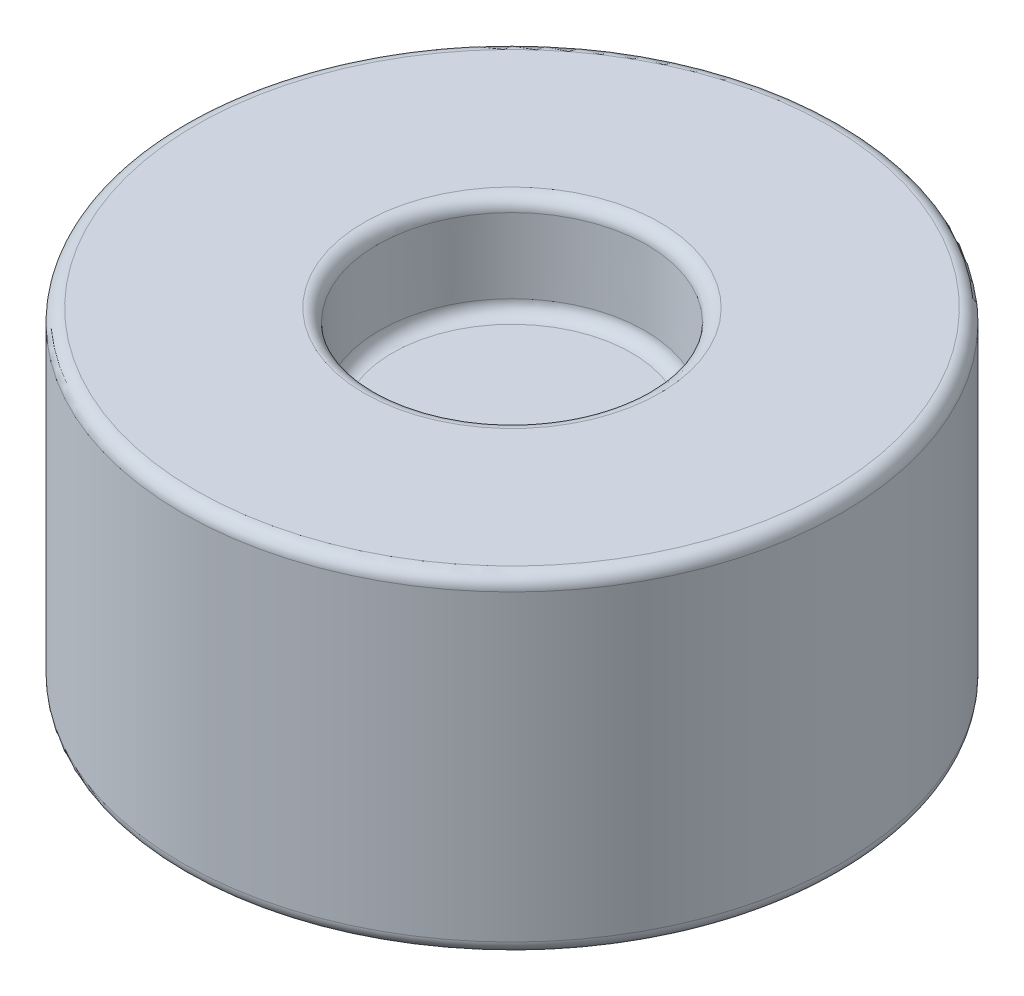
ISO-10303-21;
HEADER;
FILE_DESCRIPTION(('STEP AP214'),'2;1');
FILE_NAME('part.step','',(''),(''),'','','');
FILE_SCHEMA(('AUTOMOTIVE_DESIGN { 1 0 10303 214 1 1 1 1 }'));
ENDSEC;
DATA;
#1=APPLICATION_CONTEXT('core data for automotive mechanical design processes');
#2=APPLICATION_PROTOCOL_DEFINITION('international standard','automotive_design',2000,#1);
#3=PRODUCT_CONTEXT('',#1,'mechanical');
#4=PRODUCT('Part','Part','',(#3));
#5=PRODUCT_RELATED_PRODUCT_CATEGORY('part','',(#4));
#6=PRODUCT_DEFINITION_FORMATION('','',#4);
#7=PRODUCT_DEFINITION_CONTEXT('part definition',#1,'design');
#8=PRODUCT_DEFINITION('design','',#6,#7);
#9=PRODUCT_DEFINITION_SHAPE('','',#8);
#10=(LENGTH_UNIT() NAMED_UNIT(*) SI_UNIT(.MILLI.,.METRE.));
#11=(NAMED_UNIT(*) PLANE_ANGLE_UNIT() SI_UNIT($,.RADIAN.));
#12=(NAMED_UNIT(*) SI_UNIT($,.STERADIAN.) SOLID_ANGLE_UNIT());
#13=UNCERTAINTY_MEASURE_WITH_UNIT(LENGTH_MEASURE(1.E-05),#10,'distance_accuracy_value','');
#14=(GEOMETRIC_REPRESENTATION_CONTEXT(3) GLOBAL_UNCERTAINTY_ASSIGNED_CONTEXT((#13)) GLOBAL_UNIT_ASSIGNED_CONTEXT((#10,
#11,#12)) REPRESENTATION_CONTEXT('',''));
#15=CARTESIAN_POINT('',(0.,0.,0.));
#16=DIRECTION('',(0.,0.,1.));
#17=DIRECTION('',(1.,0.,0.));
#18=AXIS2_PLACEMENT_3D('',#15,#16,#17);
#19=CARTESIAN_POINT('',(0.,5.,0.));
#20=DIRECTION('',(0.,-1.,0.));
#21=DIRECTION('',(0.,0.,-1.));
#22=AXIS2_PLACEMENT_3D('',#19,#20,#21);
#23=CYLINDRICAL_SURFACE('',#22,5.);
#24=CARTESIAN_POINT('',(0.,0.2,0.));
#25=DIRECTION('',(0.,1.,0.));
#26=DIRECTION('',(0.,0.,1.));
#27=AXIS2_PLACEMENT_3D('',#24,#25,#26);
#28=CIRCLE('',#27,5.);
#29=CARTESIAN_POINT('',(0.,0.2,5.));
#30=VERTEX_POINT('',#29);
#31=EDGE_CURVE('E61',#30,#30,#28,.T.);
#32=ORIENTED_EDGE('',*,*,#31,.T.);
#33=EDGE_LOOP('',(#32));
#34=FACE_BOUND('',#33,.T.);
#35=CARTESIAN_POINT('',(0.,4.8,0.));
#36=DIRECTION('',(0.,1.,0.));
#37=DIRECTION('',(0.,0.,1.));
#38=AXIS2_PLACEMENT_3D('',#35,#36,#37);
#39=CIRCLE('',#38,5.);
#40=CARTESIAN_POINT('',(0.,4.8,5.));
#41=VERTEX_POINT('',#40);
#42=EDGE_CURVE('E64',#41,#41,#39,.F.);
#43=ORIENTED_EDGE('',*,*,#42,.T.);
#44=EDGE_LOOP('',(#43));
#45=FACE_BOUND('',#44,.T.);
#46=ADVANCED_FACE('F35',(#34,#45),#23,.T.);
#47=CARTESIAN_POINT('',(0.,5.,0.));
#48=DIRECTION('',(0.,1.,0.));
#49=DIRECTION('',(0.,0.,1.));
#50=AXIS2_PLACEMENT_3D('',#47,#48,#49);
#51=PLANE('',#50);
#52=CARTESIAN_POINT('',(0.,5.,0.));
#53=DIRECTION('',(0.,1.,0.));
#54=DIRECTION('',(0.,0.,1.));
#55=AXIS2_PLACEMENT_3D('',#52,#53,#54);
#56=CIRCLE('',#55,4.8);
#57=CARTESIAN_POINT('',(0.,5.,4.8));
#58=VERTEX_POINT('',#57);
#59=EDGE_CURVE('E50',#58,#58,#56,.T.);
#60=ORIENTED_EDGE('',*,*,#59,.T.);
#61=EDGE_LOOP('',(#60));
#62=FACE_BOUND('',#61,.T.);
#63=CARTESIAN_POINT('',(0.,5.,0.));
#64=DIRECTION('',(0.,1.,0.));
#65=DIRECTION('',(0.,0.,1.));
#66=AXIS2_PLACEMENT_3D('',#63,#64,#65);
#67=CIRCLE('',#66,2.24466136570599);
#68=CARTESIAN_POINT('',(0.,5.,2.24466136570599));
#69=VERTEX_POINT('',#68);
#70=EDGE_CURVE('E55',#69,#69,#67,.F.);
#71=ORIENTED_EDGE('',*,*,#70,.T.);
#72=EDGE_LOOP('',(#71));
#73=FACE_BOUND('',#72,.T.);
#74=ADVANCED_FACE('F77',(#62,#73),#51,.T.);
#75=CARTESIAN_POINT('',(0.,0.,0.));
#76=DIRECTION('',(0.,1.,0.));
#77=DIRECTION('',(0.,0.,1.));
#78=AXIS2_PLACEMENT_3D('',#75,#76,#77);
#79=PLANE('',#78);
#80=CARTESIAN_POINT('',(0.,0.,0.));
#81=DIRECTION('',(0.,1.,0.));
#82=DIRECTION('',(0.,0.,1.));
#83=AXIS2_PLACEMENT_3D('',#80,#81,#82);
#84=CIRCLE('',#83,4.8);
#85=CARTESIAN_POINT('',(0.,0.,4.8));
#86=VERTEX_POINT('',#85);
#87=EDGE_CURVE('E58',#86,#86,#84,.F.);
#88=ORIENTED_EDGE('',*,*,#87,.T.);
#89=EDGE_LOOP('',(#88));
#90=FACE_BOUND('',#89,.T.);
#91=ADVANCED_FACE('F80',(#90),#79,.F.);
#92=CARTESIAN_POINT('',(0.,5.,0.));
#93=DIRECTION('',(0.,1.,0.));
#94=DIRECTION('',(0.,0.,1.));
#95=AXIS2_PLACEMENT_3D('',#92,#93,#94);
#96=CONICAL_SURFACE('',#95,2.05,0.0270526034059122);
#97=CARTESIAN_POINT('',(0.,3.69459013923694,0.));
#98=DIRECTION('',(0.,-1.,0.));
#99=DIRECTION('',(0.,0.,-1.));
#100=AXIS2_PLACEMENT_3D('',#97,#98,#99);
#101=CIRCLE('',#100,2.01467664728055);
#102=CARTESIAN_POINT('',(0.,3.69459013923694,-2.01467664728055));
#103=VERTEX_POINT('',#102);
#104=EDGE_CURVE('E10',#103,#103,#101,.T.);
#105=ORIENTED_EDGE('',*,*,#104,.T.);
#106=EDGE_LOOP('',(#105));
#107=FACE_BOUND('',#106,.T.);
#108=CARTESIAN_POINT('',(0.,4.80540986076307,0.));
#109=DIRECTION('',(0.,1.,0.));
#110=DIRECTION('',(0.,0.,1.));
#111=AXIS2_PLACEMENT_3D('',#108,#109,#110);
#112=CIRCLE('',#111,2.04473454557791);
#113=CARTESIAN_POINT('',(0.,4.80540986076307,2.04473454557791));
#114=VERTEX_POINT('',#113);
#115=EDGE_CURVE('E46',#114,#114,#112,.T.);
#116=ORIENTED_EDGE('',*,*,#115,.T.);
#117=EDGE_LOOP('',(#116));
#118=FACE_BOUND('',#117,.T.);
#119=ADVANCED_FACE('F88',(#107,#118),#96,.F.);
#120=CARTESIAN_POINT('',(0.,3.5,0.));
#121=DIRECTION('',(0.,1.,0.));
#122=DIRECTION('',(0.,0.,1.));
#123=AXIS2_PLACEMENT_3D('',#120,#121,#122);
#124=PLANE('',#123);
#125=CARTESIAN_POINT('',(0.,3.5,0.));
#126=DIRECTION('',(0.,1.,0.));
#127=DIRECTION('',(0.,0.,1.));
#128=AXIS2_PLACEMENT_3D('',#125,#126,#127);
#129=CIRCLE('',#128,1.81474982715247);
#130=CARTESIAN_POINT('',(0.,3.5,1.81474982715247));
#131=VERTEX_POINT('',#130);
#132=EDGE_CURVE('E42',#131,#131,#129,.T.);
#133=ORIENTED_EDGE('',*,*,#132,.T.);
#134=EDGE_LOOP('',(#133));
#135=FACE_BOUND('',#134,.T.);
#136=ADVANCED_FACE('F90',(#135),#124,.T.);
#137=CARTESIAN_POINT('',(0.,0.2,0.));
#138=DIRECTION('',(0.,1.,0.));
#139=DIRECTION('',(0.,0.,1.));
#140=AXIS2_PLACEMENT_3D('',#137,#138,#139);
#141=TOROIDAL_SURFACE('',#140,4.8,0.2);
#142=ORIENTED_EDGE('',*,*,#87,.F.);
#143=EDGE_LOOP('',(#142));
#144=FACE_BOUND('',#143,.T.);
#145=ORIENTED_EDGE('',*,*,#31,.F.);
#146=EDGE_LOOP('',(#145));
#147=FACE_BOUND('',#146,.T.);
#148=ADVANCED_FACE('F73',(#144,#147),#141,.T.);
#149=CARTESIAN_POINT('',(0.,4.8,0.));
#150=DIRECTION('',(0.,1.,0.));
#151=DIRECTION('',(0.,0.,1.));
#152=AXIS2_PLACEMENT_3D('',#149,#150,#151);
#153=TOROIDAL_SURFACE('',#152,4.8,0.2);
#154=ORIENTED_EDGE('',*,*,#42,.F.);
#155=EDGE_LOOP('',(#154));
#156=FACE_BOUND('',#155,.T.);
#157=ORIENTED_EDGE('',*,*,#59,.F.);
#158=EDGE_LOOP('',(#157));
#159=FACE_BOUND('',#158,.T.);
#160=ADVANCED_FACE('F69',(#156,#159),#153,.T.);
#161=CARTESIAN_POINT('',(0.,4.8,0.));
#162=DIRECTION('',(0.,1.,0.));
#163=DIRECTION('',(0.,0.,1.));
#164=AXIS2_PLACEMENT_3D('',#161,#162,#163);
#165=TOROIDAL_SURFACE('',#164,2.24466136570599,0.2);
#166=ORIENTED_EDGE('',*,*,#70,.F.);
#167=EDGE_LOOP('',(#166));
#168=FACE_BOUND('',#167,.T.);
#169=ORIENTED_EDGE('',*,*,#115,.F.);
#170=EDGE_LOOP('',(#169));
#171=FACE_BOUND('',#170,.T.);
#172=ADVANCED_FACE('F72',(#168,#171),#165,.T.);
#173=CARTESIAN_POINT('',(0.,3.7,0.));
#174=DIRECTION('',(0.,1.,0.));
#175=DIRECTION('',(0.,0.,1.));
#176=AXIS2_PLACEMENT_3D('',#173,#174,#175);
#177=TOROIDAL_SURFACE('',#176,1.81474982715247,0.2);
#178=ORIENTED_EDGE('',*,*,#104,.F.);
#179=EDGE_LOOP('',(#178));
#180=FACE_BOUND('',#179,.T.);
#181=ORIENTED_EDGE('',*,*,#132,.F.);
#182=EDGE_LOOP('',(#181));
#183=FACE_BOUND('',#182,.T.);
#184=ADVANCED_FACE('F37',(#180,#183),#177,.F.);
#185=CLOSED_SHELL('',(#46,#74,#91,#119,#136,#148,#160,#172,#184));
#186=MANIFOLD_SOLID_BREP('B2',#185);
#187=ADVANCED_BREP_SHAPE_REPRESENTATION('',(#18,#186),#14);
#188=SHAPE_DEFINITION_REPRESENTATION(#9,#187);
ENDSEC;
END-ISO-10303-21;
